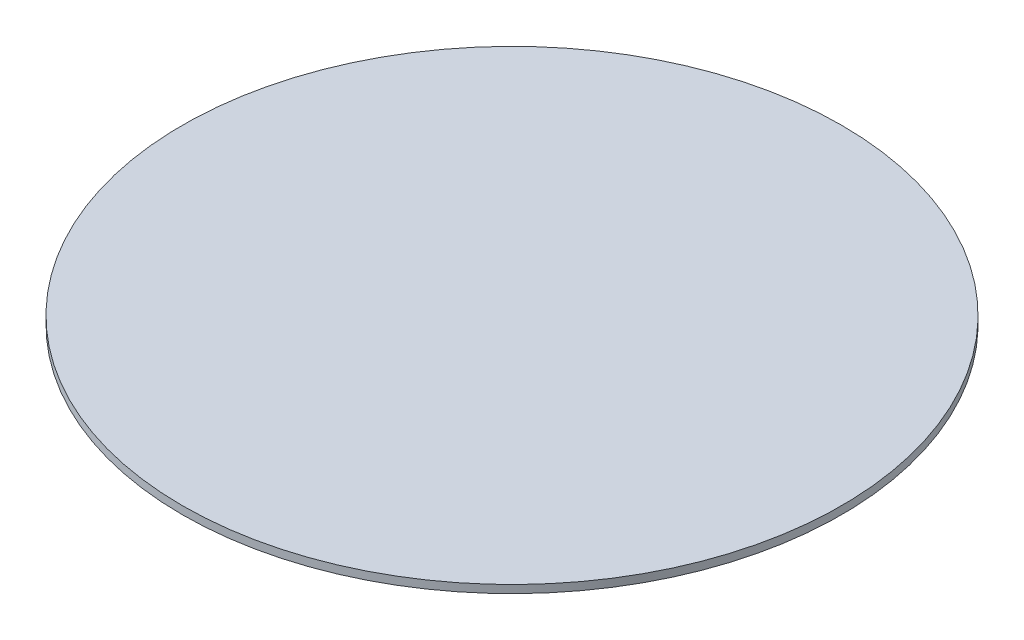
ISO-10303-21;
HEADER;
FILE_DESCRIPTION(('STEP AP214'),'2;1');
FILE_NAME('part.step','',(''),(''),'','','');
FILE_SCHEMA(('AUTOMOTIVE_DESIGN { 1 0 10303 214 1 1 1 1 }'));
ENDSEC;
DATA;
#1=APPLICATION_CONTEXT('core data for automotive mechanical design processes');
#2=APPLICATION_PROTOCOL_DEFINITION('international standard','automotive_design',2000,#1);
#3=PRODUCT_CONTEXT('',#1,'mechanical');
#4=PRODUCT('Part','Part','',(#3));
#5=PRODUCT_RELATED_PRODUCT_CATEGORY('part','',(#4));
#6=PRODUCT_DEFINITION_FORMATION('','',#4);
#7=PRODUCT_DEFINITION_CONTEXT('part definition',#1,'design');
#8=PRODUCT_DEFINITION('design','',#6,#7);
#9=PRODUCT_DEFINITION_SHAPE('','',#8);
#10=(LENGTH_UNIT() NAMED_UNIT(*) SI_UNIT(.MILLI.,.METRE.));
#11=(NAMED_UNIT(*) PLANE_ANGLE_UNIT() SI_UNIT($,.RADIAN.));
#12=(NAMED_UNIT(*) SI_UNIT($,.STERADIAN.) SOLID_ANGLE_UNIT());
#13=UNCERTAINTY_MEASURE_WITH_UNIT(LENGTH_MEASURE(1.E-05),#10,'distance_accuracy_value','');
#14=(GEOMETRIC_REPRESENTATION_CONTEXT(3) GLOBAL_UNCERTAINTY_ASSIGNED_CONTEXT((#13)) GLOBAL_UNIT_ASSIGNED_CONTEXT((#10,
#11,#12)) REPRESENTATION_CONTEXT('',''));
#15=CARTESIAN_POINT('',(0.,0.,0.));
#16=DIRECTION('',(0.,0.,1.));
#17=DIRECTION('',(1.,0.,0.));
#18=AXIS2_PLACEMENT_3D('',#15,#16,#17);
#19=CARTESIAN_POINT('',(0.,3.,0.));
#20=DIRECTION('',(0.,-1.,0.));
#21=DIRECTION('',(0.,0.,-1.));
#22=AXIS2_PLACEMENT_3D('',#19,#20,#21);
#23=CYLINDRICAL_SURFACE('',#22,125.);
#24=CARTESIAN_POINT('',(0.,3.,0.));
#25=DIRECTION('',(0.,1.,0.));
#26=DIRECTION('',(0.,0.,1.));
#27=AXIS2_PLACEMENT_3D('',#24,#25,#26);
#28=CIRCLE('',#27,125.);
#29=CARTESIAN_POINT('',(0.,3.,125.));
#30=VERTEX_POINT('',#29);
#31=EDGE_CURVE('E10',#30,#30,#28,.T.);
#32=ORIENTED_EDGE('',*,*,#31,.F.);
#33=EDGE_LOOP('',(#32));
#34=FACE_BOUND('',#33,.T.);
#35=CARTESIAN_POINT('',(0.,0.,0.));
#36=DIRECTION('',(0.,1.,0.));
#37=DIRECTION('',(0.,0.,1.));
#38=AXIS2_PLACEMENT_3D('',#35,#36,#37);
#39=CIRCLE('',#38,125.);
#40=CARTESIAN_POINT('',(0.,0.,125.));
#41=VERTEX_POINT('',#40);
#42=EDGE_CURVE('E34',#41,#41,#39,.T.);
#43=ORIENTED_EDGE('',*,*,#42,.T.);
#44=EDGE_LOOP('',(#43));
#45=FACE_BOUND('',#44,.T.);
#46=ADVANCED_FACE('F31',(#34,#45),#23,.T.);
#47=CARTESIAN_POINT('',(0.,3.,0.));
#48=DIRECTION('',(0.,1.,0.));
#49=DIRECTION('',(0.,0.,1.));
#50=AXIS2_PLACEMENT_3D('',#47,#48,#49);
#51=PLANE('',#50);
#52=ORIENTED_EDGE('',*,*,#31,.T.);
#53=EDGE_LOOP('',(#52));
#54=FACE_BOUND('',#53,.T.);
#55=ADVANCED_FACE('F46',(#54),#51,.T.);
#56=CARTESIAN_POINT('',(0.,0.,0.));
#57=DIRECTION('',(0.,1.,0.));
#58=DIRECTION('',(0.,0.,1.));
#59=AXIS2_PLACEMENT_3D('',#56,#57,#58);
#60=PLANE('',#59);
#61=ORIENTED_EDGE('',*,*,#42,.F.);
#62=EDGE_LOOP('',(#61));
#63=FACE_BOUND('',#62,.T.);
#64=ADVANCED_FACE('F44',(#63),#60,.F.);
#65=CLOSED_SHELL('',(#46,#55,#64));
#66=MANIFOLD_SOLID_BREP('B2',#65);
#67=ADVANCED_BREP_SHAPE_REPRESENTATION('',(#18,#66),#14);
#68=SHAPE_DEFINITION_REPRESENTATION(#9,#67);
ENDSEC;
END-ISO-10303-21;
